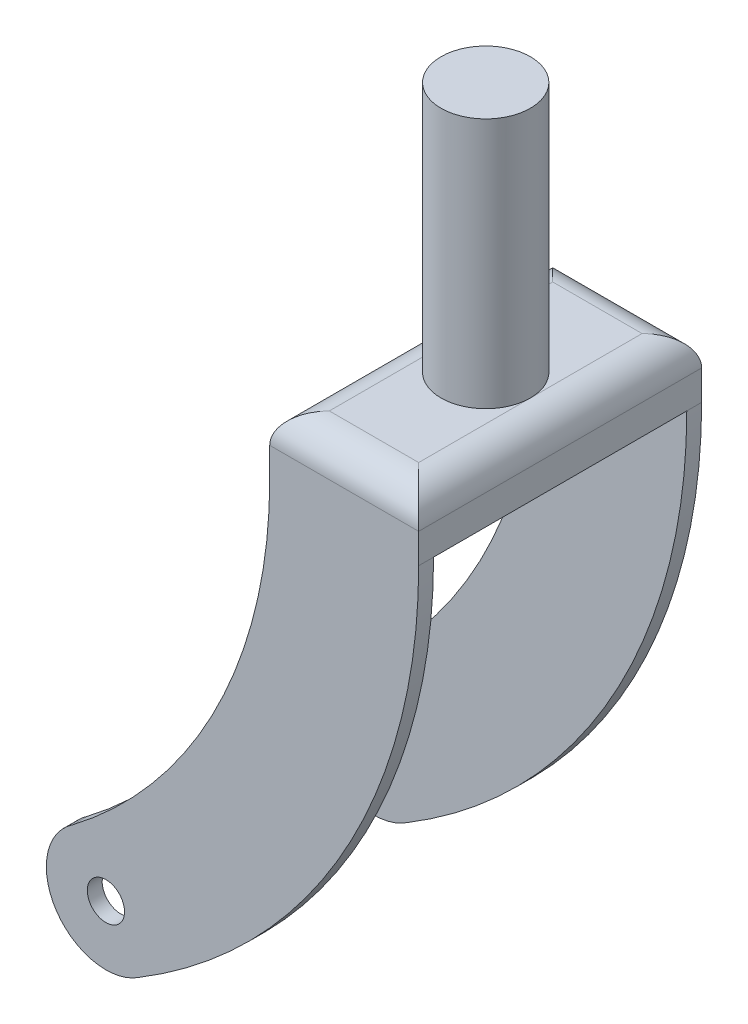
ISO-10303-21;
HEADER;
FILE_DESCRIPTION(('STEP AP214'),'2;1');
FILE_NAME('part.step','',(''),(''),'','','');
FILE_SCHEMA(('AUTOMOTIVE_DESIGN { 1 0 10303 214 1 1 1 1 }'));
ENDSEC;
DATA;
#1=APPLICATION_CONTEXT('core data for automotive mechanical design processes');
#2=APPLICATION_PROTOCOL_DEFINITION('international standard','automotive_design',2000,#1);
#3=PRODUCT_CONTEXT('',#1,'mechanical');
#4=PRODUCT('Part','Part','',(#3));
#5=PRODUCT_RELATED_PRODUCT_CATEGORY('part','',(#4));
#6=PRODUCT_DEFINITION_FORMATION('','',#4);
#7=PRODUCT_DEFINITION_CONTEXT('part definition',#1,'design');
#8=PRODUCT_DEFINITION('design','',#6,#7);
#9=PRODUCT_DEFINITION_SHAPE('','',#8);
#10=(LENGTH_UNIT() NAMED_UNIT(*) SI_UNIT(.MILLI.,.METRE.));
#11=(NAMED_UNIT(*) PLANE_ANGLE_UNIT() SI_UNIT($,.RADIAN.));
#12=(NAMED_UNIT(*) SI_UNIT($,.STERADIAN.) SOLID_ANGLE_UNIT());
#13=UNCERTAINTY_MEASURE_WITH_UNIT(LENGTH_MEASURE(1.E-05),#10,'distance_accuracy_value','');
#14=(GEOMETRIC_REPRESENTATION_CONTEXT(3) GLOBAL_UNCERTAINTY_ASSIGNED_CONTEXT((#13)) GLOBAL_UNIT_ASSIGNED_CONTEXT((#10,
#11,#12)) REPRESENTATION_CONTEXT('',''));
#15=CARTESIAN_POINT('',(0.,0.,0.));
#16=DIRECTION('',(0.,0.,1.));
#17=DIRECTION('',(1.,0.,0.));
#18=AXIS2_PLACEMENT_3D('',#15,#16,#17);
#19=CARTESIAN_POINT('',(34.925,107.95,-30.1625));
#20=DIRECTION('',(0.,1.,0.));
#21=DIRECTION('',(0.,0.,1.));
#22=AXIS2_PLACEMENT_3D('',#19,#20,#21);
#23=PLANE('',#22);
#24=CARTESIAN_POINT('',(50.8,107.95,0.));
#25=DIRECTION('',(0.,1.,0.));
#26=DIRECTION('',(0.,0.,1.));
#27=AXIS2_PLACEMENT_3D('',#24,#25,#26);
#28=CIRCLE('',#27,9.525);
#29=CARTESIAN_POINT('',(60.325,107.95,0.));
#30=VERTEX_POINT('',#29);
#31=CARTESIAN_POINT('',(41.275,107.95,0.));
#32=VERTEX_POINT('',#31);
#33=EDGE_CURVE('E197',#30,#32,#28,.T.);
#34=ORIENTED_EDGE('',*,*,#33,.F.);
#35=DIRECTION('',(0.,0.,1.));
#36=VECTOR('',#35,1.);
#37=CARTESIAN_POINT('',(60.325,107.95,-30.1625));
#38=LINE('',#37,#36);
#39=CARTESIAN_POINT('',(60.325,107.95,-23.8125));
#40=VERTEX_POINT('',#39);
#41=EDGE_CURVE('E206',#30,#40,#38,.F.);
#42=ORIENTED_EDGE('',*,*,#41,.T.);
#43=DIRECTION('',(-1.,0.,0.));
#44=VECTOR('',#43,1.);
#45=CARTESIAN_POINT('',(34.925,107.95,-23.8125));
#46=LINE('',#45,#44);
#47=CARTESIAN_POINT('',(41.275,107.95,-23.8125));
#48=VERTEX_POINT('',#47);
#49=EDGE_CURVE('E203',#40,#48,#46,.T.);
#50=ORIENTED_EDGE('',*,*,#49,.T.);
#51=DIRECTION('',(0.,0.,1.));
#52=VECTOR('',#51,1.);
#53=CARTESIAN_POINT('',(41.275,107.95,-30.1625));
#54=LINE('',#53,#52);
#55=EDGE_CURVE('E196',#48,#32,#54,.T.);
#56=ORIENTED_EDGE('',*,*,#55,.T.);
#57=EDGE_LOOP('',(#34,#42,#50,#56));
#58=FACE_BOUND('',#57,.T.);
#59=ADVANCED_FACE('F41',(#58),#23,.T.);
#60=CARTESIAN_POINT('',(-71.4873299764582,95.25,-30.1625));
#61=DIRECTION('',(0.,0.,1.));
#62=DIRECTION('',(1.,0.,0.));
#63=AXIS2_PLACEMENT_3D('',#60,#61,#62);
#64=CYLINDRICAL_SURFACE('',#63,106.412329976458);
#65=CARTESIAN_POINT('',(-71.4873299764582,95.25,26.9875));
#66=DIRECTION('',(0.,0.,1.));
#67=DIRECTION('',(0.,-1.,0.));
#68=AXIS2_PLACEMENT_3D('',#65,#66,#67);
#69=CIRCLE('',#68,106.412329976458);
#70=CARTESIAN_POINT('',(-7.07508650519029,10.5467128027682,26.9875));
#71=VERTEX_POINT('',#70);
#72=CARTESIAN_POINT('',(34.925,95.25,26.9875));
#73=VERTEX_POINT('',#72);
#74=EDGE_CURVE('E241',#71,#73,#69,.T.);
#75=ORIENTED_EDGE('',*,*,#74,.F.);
#76=DIRECTION('',(0.,0.,1.));
#77=VECTOR('',#76,1.);
#78=CARTESIAN_POINT('',(-7.07508650519028,10.5467128027682,-30.1625));
#79=LINE('',#78,#77);
#80=CARTESIAN_POINT('',(-7.07508650519028,10.5467128027682,30.1625));
#81=VERTEX_POINT('',#80);
#82=EDGE_CURVE('E186',#71,#81,#79,.T.);
#83=ORIENTED_EDGE('',*,*,#82,.T.);
#84=CARTESIAN_POINT('',(-71.4873299764582,95.25,30.1625));
#85=DIRECTION('',(0.,0.,-1.));
#86=DIRECTION('',(1.,0.,0.));
#87=AXIS2_PLACEMENT_3D('',#84,#85,#86);
#88=CIRCLE('',#87,106.412329976458);
#89=CARTESIAN_POINT('',(34.925,95.25,30.1625));
#90=VERTEX_POINT('',#89);
#91=EDGE_CURVE('E247',#90,#81,#88,.T.);
#92=ORIENTED_EDGE('',*,*,#91,.F.);
#93=DIRECTION('',(0.,0.,1.));
#94=VECTOR('',#93,1.);
#95=CARTESIAN_POINT('',(34.925,95.25,-30.1625));
#96=LINE('',#95,#94);
#97=EDGE_CURVE('E173',#73,#90,#96,.T.);
#98=ORIENTED_EDGE('',*,*,#97,.F.);
#99=EDGE_LOOP('',(#75,#83,#92,#98));
#100=FACE_BOUND('',#99,.T.);
#101=ADVANCED_FACE('F281',(#100),#64,.F.);
#102=CARTESIAN_POINT('',(-57.025633640553,95.25,-30.1625));
#103=DIRECTION('',(0.,0.,1.));
#104=DIRECTION('',(1.,0.,0.));
#105=AXIS2_PLACEMENT_3D('',#102,#103,#104);
#106=CYLINDRICAL_SURFACE('',#105,123.700633640553);
#107=CARTESIAN_POINT('',(-57.025633640553,95.25,26.9875));
#108=DIRECTION('',(0.,0.,1.));
#109=DIRECTION('',(0.,-1.,0.));
#110=AXIS2_PLACEMENT_3D('',#107,#108,#109);
#111=CIRCLE('',#110,123.700633640553);
#112=CARTESIAN_POINT('',(66.675,95.25,26.9875));
#113=VERTEX_POINT('',#112);
#114=CARTESIAN_POINT('',(7.07508650519037,-10.5467128027681,26.9875));
#115=VERTEX_POINT('',#114);
#116=EDGE_CURVE('E238',#113,#115,#111,.F.);
#117=ORIENTED_EDGE('',*,*,#116,.F.);
#118=DIRECTION('',(0.,0.,1.));
#119=VECTOR('',#118,1.);
#120=CARTESIAN_POINT('',(66.675,95.25,-30.1625));
#121=LINE('',#120,#119);
#122=CARTESIAN_POINT('',(66.675,95.25,30.1625));
#123=VERTEX_POINT('',#122);
#124=EDGE_CURVE('E166',#113,#123,#121,.T.);
#125=ORIENTED_EDGE('',*,*,#124,.T.);
#126=CARTESIAN_POINT('',(-57.025633640553,95.25,30.1625));
#127=DIRECTION('',(0.,0.,1.));
#128=DIRECTION('',(1.,0.,0.));
#129=AXIS2_PLACEMENT_3D('',#126,#127,#128);
#130=CIRCLE('',#129,123.700633640553);
#131=CARTESIAN_POINT('',(7.07508650519037,-10.5467128027681,30.1625));
#132=VERTEX_POINT('',#131);
#133=EDGE_CURVE('E253',#132,#123,#130,.T.);
#134=ORIENTED_EDGE('',*,*,#133,.F.);
#135=DIRECTION('',(0.,0.,1.));
#136=VECTOR('',#135,1.);
#137=CARTESIAN_POINT('',(7.07508650519037,-10.5467128027681,-30.1625));
#138=LINE('',#137,#136);
#139=EDGE_CURVE('E182',#115,#132,#138,.T.);
#140=ORIENTED_EDGE('',*,*,#139,.F.);
#141=EDGE_LOOP('',(#117,#125,#134,#140));
#142=FACE_BOUND('',#141,.T.);
#143=ADVANCED_FACE('F320',(#142),#106,.T.);
#144=CARTESIAN_POINT('',(0.,0.,-30.1625));
#145=DIRECTION('',(0.,0.,1.));
#146=DIRECTION('',(1.,0.,0.));
#147=AXIS2_PLACEMENT_3D('',#144,#145,#146);
#148=CYLINDRICAL_SURFACE('',#147,12.7);
#149=CARTESIAN_POINT('',(7.07508650519037,-10.5467128027681,-30.1625));
#150=VERTEX_POINT('',#149);
#151=CARTESIAN_POINT('',(7.07508650519037,-10.5467128027681,-26.9875));
#152=VERTEX_POINT('',#151);
#153=EDGE_CURVE('E178',#150,#152,#138,.T.);
#154=ORIENTED_EDGE('',*,*,#153,.T.);
#155=CARTESIAN_POINT('',(0.,0.,-26.9875));
#156=DIRECTION('',(0.,0.,-1.));
#157=DIRECTION('',(0.,1.,0.));
#158=AXIS2_PLACEMENT_3D('',#155,#156,#157);
#159=CIRCLE('',#158,12.7);
#160=CARTESIAN_POINT('',(-7.07508650519028,10.5467128027682,-26.9875));
#161=VERTEX_POINT('',#160);
#162=EDGE_CURVE('E145',#161,#152,#159,.F.);
#163=ORIENTED_EDGE('',*,*,#162,.F.);
#164=CARTESIAN_POINT('',(-7.07508650519028,10.5467128027682,-30.1625));
#165=VERTEX_POINT('',#164);
#166=EDGE_CURVE('E183',#165,#161,#79,.T.);
#167=ORIENTED_EDGE('',*,*,#166,.F.);
#168=CARTESIAN_POINT('',(0.,0.,-30.1625));
#169=DIRECTION('',(0.,0.,1.));
#170=DIRECTION('',(1.,0.,0.));
#171=AXIS2_PLACEMENT_3D('',#168,#169,#170);
#172=CIRCLE('',#171,12.7);
#173=EDGE_CURVE('E266',#165,#150,#172,.T.);
#174=ORIENTED_EDGE('',*,*,#173,.T.);
#175=EDGE_LOOP('',(#154,#163,#167,#174));
#176=FACE_BOUND('',#175,.T.);
#177=ADVANCED_FACE('F317',(#176),#148,.T.);
#178=CARTESIAN_POINT('',(0.,0.,-30.1625));
#179=DIRECTION('',(0.,0.,1.));
#180=DIRECTION('',(1.,0.,0.));
#181=AXIS2_PLACEMENT_3D('',#178,#179,#180);
#182=CYLINDRICAL_SURFACE('',#181,3.969);
#183=CARTESIAN_POINT('',(0.,0.,26.9875));
#184=DIRECTION('',(0.,0.,1.));
#185=DIRECTION('',(0.,-1.,0.));
#186=AXIS2_PLACEMENT_3D('',#183,#184,#185);
#187=CIRCLE('',#186,3.969);
#188=CARTESIAN_POINT('',(0.,-3.969,26.9875));
#189=VERTEX_POINT('',#188);
#190=EDGE_CURVE('E190',#189,#189,#187,.F.);
#191=ORIENTED_EDGE('',*,*,#190,.T.);
#192=EDGE_LOOP('',(#191));
#193=FACE_BOUND('',#192,.T.);
#194=CARTESIAN_POINT('',(0.,0.,30.1625));
#195=DIRECTION('',(0.,0.,1.));
#196=DIRECTION('',(1.,0.,0.));
#197=AXIS2_PLACEMENT_3D('',#194,#195,#196);
#198=CIRCLE('',#197,3.969);
#199=CARTESIAN_POINT('',(3.969,0.,30.1625));
#200=VERTEX_POINT('',#199);
#201=EDGE_CURVE('E244',#200,#200,#198,.T.);
#202=ORIENTED_EDGE('',*,*,#201,.T.);
#203=EDGE_LOOP('',(#202));
#204=FACE_BOUND('',#203,.T.);
#205=ADVANCED_FACE('F319',(#193,#204),#182,.F.);
#206=CARTESIAN_POINT('',(-71.4873299764582,95.25,-26.9875));
#207=DIRECTION('',(0.,0.,-1.));
#208=DIRECTION('',(0.,1.,0.));
#209=AXIS2_PLACEMENT_3D('',#206,#207,#208);
#210=CIRCLE('',#209,106.412329976458);
#211=CARTESIAN_POINT('',(34.925,95.25,-26.9875));
#212=VERTEX_POINT('',#211);
#213=EDGE_CURVE('E149',#212,#161,#210,.T.);
#214=ORIENTED_EDGE('',*,*,#213,.F.);
#215=CARTESIAN_POINT('',(34.925,95.25,-30.1625));
#216=VERTEX_POINT('',#215);
#217=EDGE_CURVE('E176',#216,#212,#96,.T.);
#218=ORIENTED_EDGE('',*,*,#217,.F.);
#219=CARTESIAN_POINT('',(-71.4873299764582,95.25,-30.1625));
#220=DIRECTION('',(0.,0.,-1.));
#221=DIRECTION('',(1.,0.,0.));
#222=AXIS2_PLACEMENT_3D('',#219,#220,#221);
#223=CIRCLE('',#222,106.412329976458);
#224=EDGE_CURVE('E263',#216,#165,#223,.T.);
#225=ORIENTED_EDGE('',*,*,#224,.T.);
#226=ORIENTED_EDGE('',*,*,#166,.T.);
#227=EDGE_LOOP('',(#214,#218,#225,#226));
#228=FACE_BOUND('',#227,.T.);
#229=ADVANCED_FACE('F315',(#228),#64,.F.);
#230=CARTESIAN_POINT('',(34.925,95.25,-30.1625));
#231=DIRECTION('',(-1.,0.,0.));
#232=DIRECTION('',(0.,0.,1.));
#233=AXIS2_PLACEMENT_3D('',#230,#231,#232);
#234=PLANE('',#233);
#235=DIRECTION('',(0.,-1.,0.));
#236=VECTOR('',#235,1.);
#237=CARTESIAN_POINT('',(34.925,95.25,30.1625));
#238=LINE('',#237,#236);
#239=CARTESIAN_POINT('',(34.925,101.6,30.1625));
#240=VERTEX_POINT('',#239);
#241=EDGE_CURVE('E258',#240,#90,#238,.T.);
#242=ORIENTED_EDGE('',*,*,#241,.F.);
#243=DIRECTION('',(0.,0.,1.));
#244=VECTOR('',#243,1.);
#245=CARTESIAN_POINT('',(34.925,101.6,-30.1625));
#246=LINE('',#245,#244);
#247=CARTESIAN_POINT('',(34.925,101.6,-30.1625));
#248=VERTEX_POINT('',#247);
#249=EDGE_CURVE('E11',#240,#248,#246,.F.);
#250=ORIENTED_EDGE('',*,*,#249,.T.);
#251=DIRECTION('',(0.,-1.,0.));
#252=VECTOR('',#251,1.);
#253=CARTESIAN_POINT('',(34.925,95.25,-30.1625));
#254=LINE('',#253,#252);
#255=EDGE_CURVE('E271',#248,#216,#254,.T.);
#256=ORIENTED_EDGE('',*,*,#255,.T.);
#257=ORIENTED_EDGE('',*,*,#217,.T.);
#258=DIRECTION('',(0.,0.,-1.));
#259=VECTOR('',#258,1.);
#260=CARTESIAN_POINT('',(34.925,95.25,-30.1625));
#261=LINE('',#260,#259);
#262=EDGE_CURVE('E159',#73,#212,#261,.T.);
#263=ORIENTED_EDGE('',*,*,#262,.F.);
#264=ORIENTED_EDGE('',*,*,#97,.T.);
#265=EDGE_LOOP('',(#242,#250,#256,#257,#263,#264));
#266=FACE_BOUND('',#265,.T.);
#267=ADVANCED_FACE('F289',(#266),#234,.T.);
#268=DIRECTION('',(-1.,0.,0.));
#269=VECTOR('',#268,1.);
#270=CARTESIAN_POINT('',(34.925,107.95,23.8125));
#271=LINE('',#270,#269);
#272=CARTESIAN_POINT('',(41.275,107.95,23.8125));
#273=VERTEX_POINT('',#272);
#274=CARTESIAN_POINT('',(60.325,107.95,23.8125));
#275=VERTEX_POINT('',#274);
#276=EDGE_CURVE('E199',#273,#275,#271,.F.);
#277=ORIENTED_EDGE('',*,*,#276,.T.);
#278=DIRECTION('',(0.,0.,1.));
#279=VECTOR('',#278,1.);
#280=CARTESIAN_POINT('',(60.325,107.95,-30.1625));
#281=LINE('',#280,#279);
#282=EDGE_CURVE('E201',#275,#30,#281,.F.);
#283=ORIENTED_EDGE('',*,*,#282,.T.);
#284=EDGE_CURVE('E232',#32,#30,#28,.T.);
#285=ORIENTED_EDGE('',*,*,#284,.F.);
#286=DIRECTION('',(0.,0.,1.));
#287=VECTOR('',#286,1.);
#288=CARTESIAN_POINT('',(41.275,107.95,-30.1625));
#289=LINE('',#288,#287);
#290=EDGE_CURVE('E194',#32,#273,#289,.T.);
#291=ORIENTED_EDGE('',*,*,#290,.T.);
#292=EDGE_LOOP('',(#277,#283,#285,#291));
#293=FACE_BOUND('',#292,.T.);
#294=ADVANCED_FACE('F310',(#293),#23,.T.);
#295=CARTESIAN_POINT('',(66.675,107.95,-30.1625));
#296=DIRECTION('',(1.,0.,0.));
#297=DIRECTION('',(0.,0.,-1.));
#298=AXIS2_PLACEMENT_3D('',#295,#296,#297);
#299=PLANE('',#298);
#300=DIRECTION('',(0.,1.,0.));
#301=VECTOR('',#300,1.);
#302=CARTESIAN_POINT('',(66.675,107.95,-30.1625));
#303=LINE('',#302,#301);
#304=CARTESIAN_POINT('',(66.675,95.25,-30.1625));
#305=VERTEX_POINT('',#304);
#306=CARTESIAN_POINT('',(66.675,101.6,-30.1625));
#307=VERTEX_POINT('',#306);
#308=EDGE_CURVE('E270',#305,#307,#303,.T.);
#309=ORIENTED_EDGE('',*,*,#308,.T.);
#310=DIRECTION('',(0.,0.,1.));
#311=VECTOR('',#310,1.);
#312=CARTESIAN_POINT('',(66.675,101.6,-30.1625));
#313=LINE('',#312,#311);
#314=CARTESIAN_POINT('',(66.675,101.6,30.1625));
#315=VERTEX_POINT('',#314);
#316=EDGE_CURVE('E65',#307,#315,#313,.T.);
#317=ORIENTED_EDGE('',*,*,#316,.T.);
#318=DIRECTION('',(0.,1.,0.));
#319=VECTOR('',#318,1.);
#320=CARTESIAN_POINT('',(66.675,107.95,30.1625));
#321=LINE('',#320,#319);
#322=EDGE_CURVE('E256',#123,#315,#321,.T.);
#323=ORIENTED_EDGE('',*,*,#322,.F.);
#324=ORIENTED_EDGE('',*,*,#124,.F.);
#325=DIRECTION('',(0.,0.,1.));
#326=VECTOR('',#325,1.);
#327=CARTESIAN_POINT('',(66.675,95.25,26.9875));
#328=LINE('',#327,#326);
#329=CARTESIAN_POINT('',(66.675,95.25,-26.9875));
#330=VERTEX_POINT('',#329);
#331=EDGE_CURVE('E156',#330,#113,#328,.T.);
#332=ORIENTED_EDGE('',*,*,#331,.F.);
#333=EDGE_CURVE('E164',#305,#330,#121,.T.);
#334=ORIENTED_EDGE('',*,*,#333,.F.);
#335=EDGE_LOOP('',(#309,#317,#323,#324,#332,#334));
#336=FACE_BOUND('',#335,.T.);
#337=ADVANCED_FACE('F163',(#336),#299,.T.);
#338=CARTESIAN_POINT('',(-57.025633640553,95.25,-26.9875));
#339=DIRECTION('',(0.,0.,-1.));
#340=DIRECTION('',(0.,1.,0.));
#341=AXIS2_PLACEMENT_3D('',#338,#339,#340);
#342=CIRCLE('',#341,123.700633640553);
#343=EDGE_CURVE('E138',#152,#330,#342,.F.);
#344=ORIENTED_EDGE('',*,*,#343,.F.);
#345=ORIENTED_EDGE('',*,*,#153,.F.);
#346=CARTESIAN_POINT('',(-57.025633640553,95.25,-30.1625));
#347=DIRECTION('',(0.,0.,1.));
#348=DIRECTION('',(1.,0.,0.));
#349=AXIS2_PLACEMENT_3D('',#346,#347,#348);
#350=CIRCLE('',#349,123.700633640553);
#351=EDGE_CURVE('E172',#150,#305,#350,.T.);
#352=ORIENTED_EDGE('',*,*,#351,.T.);
#353=ORIENTED_EDGE('',*,*,#333,.T.);
#354=EDGE_LOOP('',(#344,#345,#352,#353));
#355=FACE_BOUND('',#354,.T.);
#356=ADVANCED_FACE('F170',(#355),#106,.T.);
#357=CARTESIAN_POINT('',(0.,0.,26.9875));
#358=DIRECTION('',(0.,0.,1.));
#359=DIRECTION('',(0.,-1.,0.));
#360=AXIS2_PLACEMENT_3D('',#357,#358,#359);
#361=CIRCLE('',#360,12.7);
#362=EDGE_CURVE('E193',#115,#71,#361,.F.);
#363=ORIENTED_EDGE('',*,*,#362,.F.);
#364=ORIENTED_EDGE('',*,*,#139,.T.);
#365=CARTESIAN_POINT('',(0.,0.,30.1625));
#366=DIRECTION('',(0.,0.,1.));
#367=DIRECTION('',(1.,0.,0.));
#368=AXIS2_PLACEMENT_3D('',#365,#366,#367);
#369=CIRCLE('',#368,12.7);
#370=EDGE_CURVE('E250',#81,#132,#369,.T.);
#371=ORIENTED_EDGE('',*,*,#370,.F.);
#372=ORIENTED_EDGE('',*,*,#82,.F.);
#373=EDGE_LOOP('',(#363,#364,#371,#372));
#374=FACE_BOUND('',#373,.T.);
#375=ADVANCED_FACE('F284',(#374),#148,.T.);
#376=CARTESIAN_POINT('',(-71.4873299764582,95.25,-30.1625));
#377=DIRECTION('',(0.,0.,1.));
#378=DIRECTION('',(1.,0.,0.));
#379=AXIS2_PLACEMENT_3D('',#376,#377,#378);
#380=PLANE('',#379);
#381=CARTESIAN_POINT('',(0.,0.,-30.1625));
#382=DIRECTION('',(0.,0.,1.));
#383=DIRECTION('',(1.,0.,0.));
#384=AXIS2_PLACEMENT_3D('',#381,#382,#383);
#385=CIRCLE('',#384,3.969);
#386=CARTESIAN_POINT('',(3.969,0.,-30.1625));
#387=VERTEX_POINT('',#386);
#388=EDGE_CURVE('E260',#387,#387,#385,.T.);
#389=ORIENTED_EDGE('',*,*,#388,.T.);
#390=EDGE_LOOP('',(#389));
#391=FACE_BOUND('',#390,.T.);
#392=ORIENTED_EDGE('',*,*,#255,.F.);
#393=DIRECTION('',(-1.,0.,0.));
#394=VECTOR('',#393,1.);
#395=CARTESIAN_POINT('',(66.675,101.6,-30.1625));
#396=LINE('',#395,#394);
#397=EDGE_CURVE('E208',#248,#307,#396,.F.);
#398=ORIENTED_EDGE('',*,*,#397,.T.);
#399=ORIENTED_EDGE('',*,*,#308,.F.);
#400=ORIENTED_EDGE('',*,*,#351,.F.);
#401=ORIENTED_EDGE('',*,*,#173,.F.);
#402=ORIENTED_EDGE('',*,*,#224,.F.);
#403=EDGE_LOOP('',(#392,#398,#399,#400,#401,#402));
#404=FACE_BOUND('',#403,.T.);
#405=ADVANCED_FACE('F313',(#391,#404),#380,.F.);
#406=CARTESIAN_POINT('',(0.,0.,-26.9875));
#407=DIRECTION('',(0.,0.,-1.));
#408=DIRECTION('',(0.,1.,0.));
#409=AXIS2_PLACEMENT_3D('',#406,#407,#408);
#410=CIRCLE('',#409,3.969);
#411=CARTESIAN_POINT('',(0.,3.969,-26.9875));
#412=VERTEX_POINT('',#411);
#413=EDGE_CURVE('E187',#412,#412,#410,.F.);
#414=ORIENTED_EDGE('',*,*,#413,.T.);
#415=EDGE_LOOP('',(#414));
#416=FACE_BOUND('',#415,.T.);
#417=ORIENTED_EDGE('',*,*,#388,.F.);
#418=EDGE_LOOP('',(#417));
#419=FACE_BOUND('',#418,.T.);
#420=ADVANCED_FACE('F328',(#416,#419),#182,.F.);
#421=CARTESIAN_POINT('',(-71.4873299764582,95.25,30.1625));
#422=DIRECTION('',(0.,0.,1.));
#423=DIRECTION('',(1.,0.,0.));
#424=AXIS2_PLACEMENT_3D('',#421,#422,#423);
#425=PLANE('',#424);
#426=ORIENTED_EDGE('',*,*,#322,.T.);
#427=DIRECTION('',(-1.,0.,0.));
#428=VECTOR('',#427,1.);
#429=CARTESIAN_POINT('',(-71.4873299764582,101.6,30.1625));
#430=LINE('',#429,#428);
#431=EDGE_CURVE('E50',#315,#240,#430,.T.);
#432=ORIENTED_EDGE('',*,*,#431,.T.);
#433=ORIENTED_EDGE('',*,*,#241,.T.);
#434=ORIENTED_EDGE('',*,*,#91,.T.);
#435=ORIENTED_EDGE('',*,*,#370,.T.);
#436=ORIENTED_EDGE('',*,*,#133,.T.);
#437=EDGE_LOOP('',(#426,#432,#433,#434,#435,#436));
#438=FACE_BOUND('',#437,.T.);
#439=ORIENTED_EDGE('',*,*,#201,.F.);
#440=EDGE_LOOP('',(#439));
#441=FACE_BOUND('',#440,.T.);
#442=ADVANCED_FACE('F287',(#438,#441),#425,.T.);
#443=CARTESIAN_POINT('',(-12.7,95.25,26.9875));
#444=DIRECTION('',(0.,0.,1.));
#445=DIRECTION('',(0.,-1.,0.));
#446=AXIS2_PLACEMENT_3D('',#443,#444,#445);
#447=PLANE('',#446);
#448=ORIENTED_EDGE('',*,*,#74,.T.);
#449=DIRECTION('',(1.,0.,0.));
#450=VECTOR('',#449,1.);
#451=CARTESIAN_POINT('',(-12.7,95.25,26.9875));
#452=LINE('',#451,#450);
#453=EDGE_CURVE('E160',#73,#113,#452,.T.);
#454=ORIENTED_EDGE('',*,*,#453,.T.);
#455=ORIENTED_EDGE('',*,*,#116,.T.);
#456=ORIENTED_EDGE('',*,*,#362,.T.);
#457=EDGE_LOOP('',(#448,#454,#455,#456));
#458=FACE_BOUND('',#457,.T.);
#459=ORIENTED_EDGE('',*,*,#190,.F.);
#460=EDGE_LOOP('',(#459));
#461=FACE_BOUND('',#460,.T.);
#462=ADVANCED_FACE('F356',(#458,#461),#447,.F.);
#463=CARTESIAN_POINT('',(-12.7,95.25,-26.9875));
#464=DIRECTION('',(0.,0.,-1.));
#465=DIRECTION('',(0.,1.,0.));
#466=AXIS2_PLACEMENT_3D('',#463,#464,#465);
#467=PLANE('',#466);
#468=ORIENTED_EDGE('',*,*,#213,.T.);
#469=ORIENTED_EDGE('',*,*,#162,.T.);
#470=ORIENTED_EDGE('',*,*,#343,.T.);
#471=DIRECTION('',(1.,0.,0.));
#472=VECTOR('',#471,1.);
#473=CARTESIAN_POINT('',(-12.7,95.25,-26.9875));
#474=LINE('',#473,#472);
#475=EDGE_CURVE('E142',#212,#330,#474,.T.);
#476=ORIENTED_EDGE('',*,*,#475,.F.);
#477=EDGE_LOOP('',(#468,#469,#470,#476));
#478=FACE_BOUND('',#477,.T.);
#479=ORIENTED_EDGE('',*,*,#413,.F.);
#480=EDGE_LOOP('',(#479));
#481=FACE_BOUND('',#480,.T.);
#482=ADVANCED_FACE('F140',(#478,#481),#467,.F.);
#483=CARTESIAN_POINT('',(-12.7,95.25,26.9875));
#484=DIRECTION('',(0.,1.,0.));
#485=DIRECTION('',(0.,0.,1.));
#486=AXIS2_PLACEMENT_3D('',#483,#484,#485);
#487=PLANE('',#486);
#488=ORIENTED_EDGE('',*,*,#262,.T.);
#489=ORIENTED_EDGE('',*,*,#475,.T.);
#490=ORIENTED_EDGE('',*,*,#331,.T.);
#491=ORIENTED_EDGE('',*,*,#453,.F.);
#492=EDGE_LOOP('',(#488,#489,#490,#491));
#493=FACE_BOUND('',#492,.T.);
#494=ADVANCED_FACE('F154',(#493),#487,.F.);
#495=CARTESIAN_POINT('',(50.8,161.45,0.));
#496=DIRECTION('',(0.,-1.,0.));
#497=DIRECTION('',(0.,0.,-1.));
#498=AXIS2_PLACEMENT_3D('',#495,#496,#497);
#499=CYLINDRICAL_SURFACE('',#498,9.525);
#500=CARTESIAN_POINT('',(50.8,161.45,0.));
#501=DIRECTION('',(0.,1.,0.));
#502=DIRECTION('',(0.,0.,1.));
#503=AXIS2_PLACEMENT_3D('',#500,#501,#502);
#504=CIRCLE('',#503,9.525);
#505=CARTESIAN_POINT('',(50.8,161.45,9.525));
#506=VERTEX_POINT('',#505);
#507=EDGE_CURVE('E167',#506,#506,#504,.T.);
#508=ORIENTED_EDGE('',*,*,#507,.F.);
#509=EDGE_LOOP('',(#508));
#510=FACE_BOUND('',#509,.T.);
#511=ORIENTED_EDGE('',*,*,#33,.T.);
#512=ORIENTED_EDGE('',*,*,#284,.T.);
#513=EDGE_LOOP('',(#511,#512));
#514=FACE_BOUND('',#513,.T.);
#515=ADVANCED_FACE('F296',(#510,#514),#499,.T.);
#516=CARTESIAN_POINT('',(50.8,161.45,0.));
#517=DIRECTION('',(0.,1.,0.));
#518=DIRECTION('',(0.,0.,1.));
#519=AXIS2_PLACEMENT_3D('',#516,#517,#518);
#520=PLANE('',#519);
#521=ORIENTED_EDGE('',*,*,#507,.T.);
#522=EDGE_LOOP('',(#521));
#523=FACE_BOUND('',#522,.T.);
#524=ADVANCED_FACE('F366',(#523),#520,.T.);
#525=CARTESIAN_POINT('',(-71.4873299764582,101.6,23.8125));
#526=DIRECTION('',(-1.,0.,0.));
#527=DIRECTION('',(0.,0.,1.));
#528=AXIS2_PLACEMENT_3D('',#525,#526,#527);
#529=CYLINDRICAL_SURFACE('',#528,6.35);
#530=CARTESIAN_POINT('',(41.275,101.6,23.8125));
#531=DIRECTION('',(0.707106781186547,0.,0.707106781186547));
#532=DIRECTION('',(-0.707106781186547,0.,0.707106781186547));
#533=AXIS2_PLACEMENT_3D('',#530,#531,#532);
#534=ELLIPSE('',#533,8.98025612106915,6.35);
#535=EDGE_CURVE('E216',#240,#273,#534,.F.);
#536=ORIENTED_EDGE('',*,*,#535,.F.);
#537=ORIENTED_EDGE('',*,*,#431,.F.);
#538=CARTESIAN_POINT('',(60.325,101.6,23.8125));
#539=DIRECTION('',(-0.707106781186547,0.,0.707106781186547));
#540=DIRECTION('',(-0.707106781186547,0.,-0.707106781186547));
#541=AXIS2_PLACEMENT_3D('',#538,#539,#540);
#542=ELLIPSE('',#541,8.98025612106915,6.35);
#543=EDGE_CURVE('E45',#275,#315,#542,.F.);
#544=ORIENTED_EDGE('',*,*,#543,.F.);
#545=ORIENTED_EDGE('',*,*,#276,.F.);
#546=EDGE_LOOP('',(#536,#537,#544,#545));
#547=FACE_BOUND('',#546,.T.);
#548=ADVANCED_FACE('F43',(#547),#529,.T.);
#549=CARTESIAN_POINT('',(60.325,101.6,-30.1625));
#550=DIRECTION('',(0.,0.,1.));
#551=DIRECTION('',(1.,0.,0.));
#552=AXIS2_PLACEMENT_3D('',#549,#550,#551);
#553=CYLINDRICAL_SURFACE('',#552,6.35);
#554=ORIENTED_EDGE('',*,*,#543,.T.);
#555=ORIENTED_EDGE('',*,*,#316,.F.);
#556=CARTESIAN_POINT('',(60.325,101.6,-23.8125));
#557=DIRECTION('',(0.707106781186547,0.,0.707106781186547));
#558=DIRECTION('',(-0.707106781186547,0.,0.707106781186547));
#559=AXIS2_PLACEMENT_3D('',#556,#557,#558);
#560=ELLIPSE('',#559,8.98025612106915,6.35);
#561=EDGE_CURVE('E215',#40,#307,#560,.F.);
#562=ORIENTED_EDGE('',*,*,#561,.F.);
#563=ORIENTED_EDGE('',*,*,#41,.F.);
#564=ORIENTED_EDGE('',*,*,#282,.F.);
#565=EDGE_LOOP('',(#554,#555,#562,#563,#564));
#566=FACE_BOUND('',#565,.T.);
#567=ADVANCED_FACE('F302',(#566),#553,.T.);
#568=CARTESIAN_POINT('',(41.275,101.6,-30.1625));
#569=DIRECTION('',(0.,0.,1.));
#570=DIRECTION('',(1.,0.,0.));
#571=AXIS2_PLACEMENT_3D('',#568,#569,#570);
#572=CYLINDRICAL_SURFACE('',#571,6.35);
#573=ORIENTED_EDGE('',*,*,#290,.F.);
#574=ORIENTED_EDGE('',*,*,#55,.F.);
#575=CARTESIAN_POINT('',(41.275,101.6,-23.8125));
#576=DIRECTION('',(-0.707106781186547,0.,0.707106781186547));
#577=DIRECTION('',(0.707106781186547,0.,0.707106781186547));
#578=AXIS2_PLACEMENT_3D('',#575,#576,#577);
#579=ELLIPSE('',#578,8.98025612106915,6.35);
#580=EDGE_CURVE('E213',#248,#48,#579,.F.);
#581=ORIENTED_EDGE('',*,*,#580,.F.);
#582=ORIENTED_EDGE('',*,*,#249,.F.);
#583=ORIENTED_EDGE('',*,*,#535,.T.);
#584=EDGE_LOOP('',(#573,#574,#581,#582,#583));
#585=FACE_BOUND('',#584,.T.);
#586=ADVANCED_FACE('F308',(#585),#572,.T.);
#587=CARTESIAN_POINT('',(34.925,101.6,-23.8125));
#588=DIRECTION('',(1.,0.,0.));
#589=DIRECTION('',(0.,0.,-1.));
#590=AXIS2_PLACEMENT_3D('',#587,#588,#589);
#591=CYLINDRICAL_SURFACE('',#590,6.35);
#592=ORIENTED_EDGE('',*,*,#561,.T.);
#593=ORIENTED_EDGE('',*,*,#397,.F.);
#594=ORIENTED_EDGE('',*,*,#580,.T.);
#595=ORIENTED_EDGE('',*,*,#49,.F.);
#596=EDGE_LOOP('',(#592,#593,#594,#595));
#597=FACE_BOUND('',#596,.T.);
#598=ADVANCED_FACE('F306',(#597),#591,.T.);
#599=CLOSED_SHELL('',(#59,#101,#143,#177,#205,#229,#267,#294,#337,#356,#375,#405,#420,#442,#462,
#482,#494,#515,#524,#548,#567,#586,#598));
#600=MANIFOLD_SOLID_BREP('B2',#599);
#601=ADVANCED_BREP_SHAPE_REPRESENTATION('',(#18,#600),#14);
#602=SHAPE_DEFINITION_REPRESENTATION(#9,#601);
ENDSEC;
END-ISO-10303-21;
